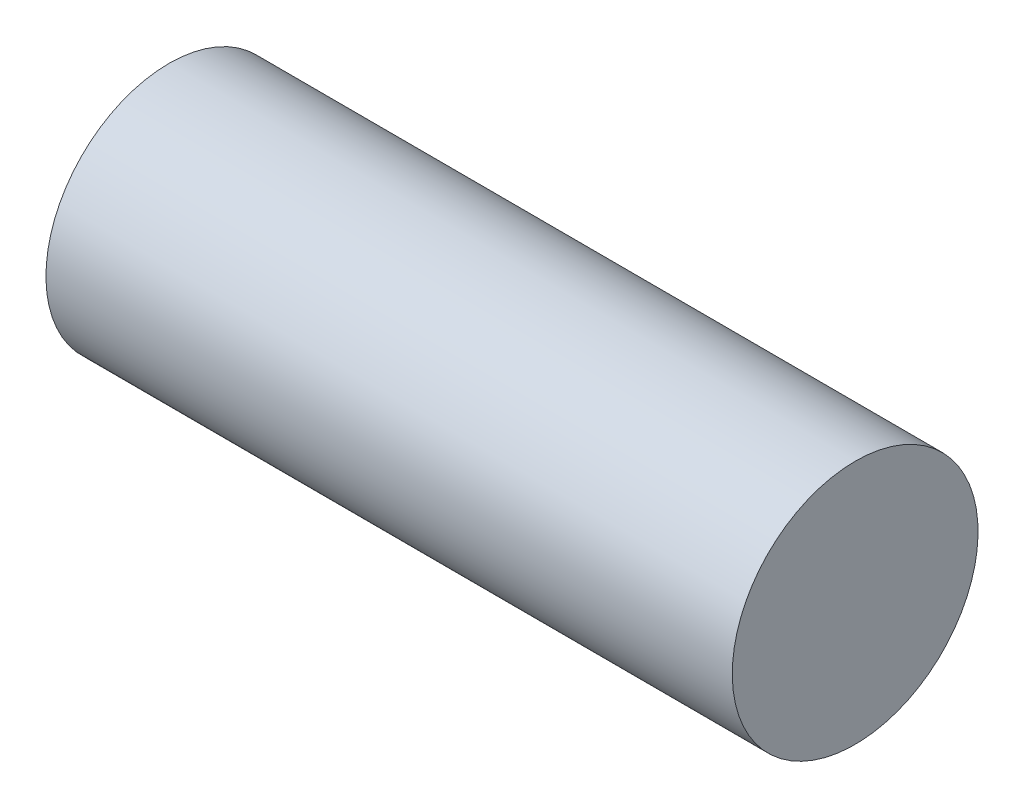
ISO-10303-21;
HEADER;
FILE_DESCRIPTION(('STEP AP214'),'2;1');
FILE_NAME('part.step','',(''),(''),'','','');
FILE_SCHEMA(('AUTOMOTIVE_DESIGN { 1 0 10303 214 1 1 1 1 }'));
ENDSEC;
DATA;
#1=APPLICATION_CONTEXT('core data for automotive mechanical design processes');
#2=APPLICATION_PROTOCOL_DEFINITION('international standard','automotive_design',2000,#1);
#3=PRODUCT_CONTEXT('',#1,'mechanical');
#4=PRODUCT('Part','Part','',(#3));
#5=PRODUCT_RELATED_PRODUCT_CATEGORY('part','',(#4));
#6=PRODUCT_DEFINITION_FORMATION('','',#4);
#7=PRODUCT_DEFINITION_CONTEXT('part definition',#1,'design');
#8=PRODUCT_DEFINITION('design','',#6,#7);
#9=PRODUCT_DEFINITION_SHAPE('','',#8);
#10=(LENGTH_UNIT() NAMED_UNIT(*) SI_UNIT(.MILLI.,.METRE.));
#11=(NAMED_UNIT(*) PLANE_ANGLE_UNIT() SI_UNIT($,.RADIAN.));
#12=(NAMED_UNIT(*) SI_UNIT($,.STERADIAN.) SOLID_ANGLE_UNIT());
#13=UNCERTAINTY_MEASURE_WITH_UNIT(LENGTH_MEASURE(1.E-05),#10,'distance_accuracy_value','');
#14=(GEOMETRIC_REPRESENTATION_CONTEXT(3) GLOBAL_UNCERTAINTY_ASSIGNED_CONTEXT((#13)) GLOBAL_UNIT_ASSIGNED_CONTEXT((#10,
#11,#12)) REPRESENTATION_CONTEXT('',''));
#15=CARTESIAN_POINT('',(0.,0.,0.));
#16=DIRECTION('',(0.,0.,1.));
#17=DIRECTION('',(1.,0.,0.));
#18=AXIS2_PLACEMENT_3D('',#15,#16,#17);
#19=CARTESIAN_POINT('',(-13.5580424451285,200.895063598058,163.321796860767));
#20=DIRECTION('',(0.999998204569047,-0.00189495611617016,-1.97773542619787E-09));
#21=DIRECTION('',(0.00189495611617016,0.999998204569047,0.));
#22=AXIS2_PLACEMENT_3D('',#19,#20,#21);
#23=PLANE('',#22);
#24=CARTESIAN_POINT('',(-13.5580424451285,200.895063598058,163.321796860767));
#25=DIRECTION('',(0.999998204569047,-0.00189495611617016,-1.97773542619787E-09));
#26=DIRECTION('',(0.00189495611617016,0.999998204569047,0.));
#27=AXIS2_PLACEMENT_3D('',#24,#25,#26);
#28=CIRCLE('',#27,4.69900000000001);
#29=CARTESIAN_POINT('',(-13.5491380463386,205.594055161327,163.321796860767));
#30=VERTEX_POINT('',#29);
#31=EDGE_CURVE('E50',#30,#30,#28,.T.);
#32=ORIENTED_EDGE('',*,*,#31,.F.);
#33=EDGE_LOOP('',(#32));
#34=FACE_BOUND('',#33,.T.);
#35=ADVANCED_FACE('F43',(#34),#23,.F.);
#36=CARTESIAN_POINT('',(12.6858057643378,200.845332568093,163.321796808863));
#37=DIRECTION('',(0.999998204569047,-0.00189495611617016,-1.97773542619787E-09));
#38=DIRECTION('',(0.00189495611617016,0.999998204569047,0.));
#39=AXIS2_PLACEMENT_3D('',#36,#37,#38);
#40=PLANE('',#39);
#41=CARTESIAN_POINT('',(12.6858057643378,200.845332568093,163.321796808863));
#42=DIRECTION('',(0.999998204569047,-0.00189495611617016,-1.97773542619787E-09));
#43=DIRECTION('',(0.00189495611617016,0.999998204569047,0.));
#44=AXIS2_PLACEMENT_3D('',#41,#42,#43);
#45=CIRCLE('',#44,4.69900000000001);
#46=CARTESIAN_POINT('',(12.6947101631277,205.544324131363,163.321796808863));
#47=VERTEX_POINT('',#46);
#48=EDGE_CURVE('E11',#47,#47,#45,.T.);
#49=ORIENTED_EDGE('',*,*,#48,.T.);
#50=EDGE_LOOP('',(#49));
#51=FACE_BOUND('',#50,.T.);
#52=ADVANCED_FACE('F60',(#51),#40,.T.);
#53=CARTESIAN_POINT('',(-13.5580424451285,200.895063598058,163.321796860767));
#54=DIRECTION('',(0.999998204569047,-0.0018949561161691,-1.97773542619787E-09));
#55=DIRECTION('',(0.0018949561161691,0.999998204569047,0.));
#56=AXIS2_PLACEMENT_3D('',#53,#54,#55);
#57=CYLINDRICAL_SURFACE('',#56,4.69900000000001);
#58=CARTESIAN_POINT('',(12.6947101631277,205.544324131363,163.321796808863));
#59=CARTESIAN_POINT('',(12.4213367442791,205.544842162925,163.321796809404));
#60=CARTESIAN_POINT('',(12.1479633254305,205.545360194487,163.321796809945));
#61=CARTESIAN_POINT('',(11.6012164877333,205.546396257611,163.321796811026));
#62=CARTESIAN_POINT('',(11.3278430688847,205.546914289173,163.321796811567));
#63=CARTESIAN_POINT('',(10.7810962311875,205.547950352297,163.321796812648));
#64=CARTESIAN_POINT('',(10.5077228123389,205.54846838386,163.321796813189));
#65=CARTESIAN_POINT('',(9.96097597464164,205.549504446984,163.32179681427));
#66=CARTESIAN_POINT('',(9.68760255579303,205.550022478546,163.321796814811));
#67=CARTESIAN_POINT('',(9.14085571809582,205.55105854167,163.321796815892));
#68=CARTESIAN_POINT('',(8.86748229924721,205.551576573232,163.321796816433));
#69=CARTESIAN_POINT('',(8.32073546155,205.552612636357,163.321796817514));
#70=CARTESIAN_POINT('',(8.04736204270139,205.553130667919,163.321796818055));
#71=CARTESIAN_POINT('',(7.50061520500418,205.554166731043,163.321796819136));
#72=CARTESIAN_POINT('',(7.22724178615557,205.554684762605,163.321796819676));
#73=CARTESIAN_POINT('',(6.68049494845836,205.555720825729,163.321796820758));
#74=CARTESIAN_POINT('',(6.40712152960975,205.556238857292,163.321796821298));
#75=CARTESIAN_POINT('',(5.86037469191253,205.557274920416,163.32179682238));
#76=CARTESIAN_POINT('',(5.58700127306393,205.557792951978,163.32179682292));
#77=CARTESIAN_POINT('',(5.04025443536671,205.558829015102,163.321796824002));
#78=CARTESIAN_POINT('',(4.7668810165181,205.559347046664,163.321796824542));
#79=CARTESIAN_POINT('',(4.22013417882089,205.560383109789,163.321796825624));
#80=CARTESIAN_POINT('',(3.94676075997228,205.560901141351,163.321796826164));
#81=CARTESIAN_POINT('',(3.40001392227507,205.561937204475,163.321796827246));
#82=CARTESIAN_POINT('',(3.12664050342646,205.562455236037,163.321796827786));
#83=CARTESIAN_POINT('',(2.57989366572925,205.563491299162,163.321796828868));
#84=CARTESIAN_POINT('',(2.30652024688064,205.564009330724,163.321796829408));
#85=CARTESIAN_POINT('',(1.75977340918343,205.565045393848,163.32179683049));
#86=CARTESIAN_POINT('',(1.48639999033482,205.56556342541,163.32179683103));
#87=CARTESIAN_POINT('',(0.939653152637605,205.566599488534,163.321796832112));
#88=CARTESIAN_POINT('',(0.666279733788998,205.567117520096,163.321796832652));
#89=CARTESIAN_POINT('',(0.119532896091783,205.568153583221,163.321796833734));
#90=CARTESIAN_POINT('',(-0.153840522756825,205.568671614783,163.321796834274));
#91=CARTESIAN_POINT('',(-0.700587360454039,205.569707677907,163.321796835356));
#92=CARTESIAN_POINT('',(-0.973960779302646,205.570225709469,163.321796835896));
#93=CARTESIAN_POINT('',(-1.52070761699986,205.571261772594,163.321796836978));
#94=CARTESIAN_POINT('',(-1.79408103584847,205.571779804156,163.321796837518));
#95=CARTESIAN_POINT('',(-2.34082787354568,205.57281586728,163.3217968386));
#96=CARTESIAN_POINT('',(-2.61420129239429,205.573333898842,163.32179683914));
#97=CARTESIAN_POINT('',(-3.1609481300915,205.574369961966,163.321796840222));
#98=CARTESIAN_POINT('',(-3.43432154894011,205.574887993528,163.321796840762));
#99=CARTESIAN_POINT('',(-3.98106838663733,205.575924056653,163.321796841844));
#100=CARTESIAN_POINT('',(-4.25444180548593,205.576442088215,163.321796842384));
#101=CARTESIAN_POINT('',(-4.80118864318315,205.577478151339,163.321796843466));
#102=CARTESIAN_POINT('',(-5.07456206203175,205.577996182901,163.321796844006));
#103=CARTESIAN_POINT('',(-5.62130889972897,205.579032246026,163.321796845088));
#104=CARTESIAN_POINT('',(-5.89468231857757,205.579550277588,163.321796845628));
#105=CARTESIAN_POINT('',(-6.44142915627479,205.580586340712,163.32179684671));
#106=CARTESIAN_POINT('',(-6.7148025751234,205.581104372274,163.32179684725));
#107=CARTESIAN_POINT('',(-7.26154941282061,205.582140435398,163.321796848332));
#108=CARTESIAN_POINT('',(-7.53492283166922,205.582658466961,163.321796848872));
#109=CARTESIAN_POINT('',(-8.08166966936643,205.583694530085,163.321796849954));
#110=CARTESIAN_POINT('',(-8.35504308821504,205.584212561647,163.321796850494));
#111=CARTESIAN_POINT('',(-8.90178992591225,205.585248624771,163.321796851575));
#112=CARTESIAN_POINT('',(-9.17516334476086,205.585766656333,163.321796852116));
#113=CARTESIAN_POINT('',(-9.72191018245807,205.586802719458,163.321796853197));
#114=CARTESIAN_POINT('',(-9.99528360130668,205.58732075102,163.321796853738));
#115=CARTESIAN_POINT('',(-10.5420304390039,205.588356814144,163.321796854819));
#116=CARTESIAN_POINT('',(-10.8154038578525,205.588874845706,163.32179685536));
#117=CARTESIAN_POINT('',(-11.3621506955497,205.58991090883,163.321796856441));
#118=CARTESIAN_POINT('',(-11.6355241143983,205.590428940393,163.321796856982));
#119=CARTESIAN_POINT('',(-12.1822709520955,205.591465003517,163.321796858063));
#120=CARTESIAN_POINT('',(-12.4556443709441,205.591983035079,163.321796858604));
#121=CARTESIAN_POINT('',(-13.0023912086414,205.593019098203,163.321796859685));
#122=CARTESIAN_POINT('',(-13.27576462749,205.593537129765,163.321796860226));
#123=CARTESIAN_POINT('',(-13.5491380463386,205.594055161327,163.321796860767));
#124=B_SPLINE_CURVE_WITH_KNOTS('',3,(#58,#59,#60,#61,#62,#63,#64,#65,#66,#67,#68,#69,#70,#71,
#72,#73,#74,#75,#76,#77,#78,#79,#80,#81,#82,#83,#84,#85,#86,#87,#88,#89,#90,#91,#92,#93,#94,#95,
#96,#97,#98,#99,#100,#101,#102,#103,#104,#105,#106,#107,#108,#109,#110,#111,#112,#113,#114,#115,
#116,#117,#118,#119,#120,#121,#122,#123),.UNSPECIFIED.,.F.,.F.,(4,2,2,2,2,2,2,2,2,2,2,2,2,2,2,2,
2,2,2,2,2,2,2,2,2,2,2,2,2,2,2,2,4),(0.,0.820121729017757,1.64024345803552,2.46036518705328,
3.28048691607104,4.10060864508879,4.92073037410655,5.74085210312431,6.56097383214207,
7.38109556115983,8.20121729017759,9.02133901919535,9.84146074821311,10.6615824772309,
11.4817042062486,12.3018259352664,13.1219476642841,13.9420693933019,14.7621911223197,
15.5823128513374,16.4024345803552,17.2225563093729,18.0426780383907,18.8627997674085,
19.6829214964262,20.503043225444,21.3231649544617,22.1432866834795,22.9634084124973,
23.783530141515,24.6036518705328,25.4237735995505,26.2438953285683),.UNSPECIFIED.);
#125=EDGE_CURVE('BSEAM57',#47,#30,#124,.T.);
#126=ORIENTED_EDGE('',*,*,#48,.F.);
#127=ORIENTED_EDGE('',*,*,#31,.T.);
#128=ORIENTED_EDGE('',*,*,#125,.T.);
#129=ORIENTED_EDGE('',*,*,#125,.F.);
#130=EDGE_LOOP('',(#126,#128,#127,#129));
#131=FACE_BOUND('',#130,.T.);
#132=ADVANCED_FACE('F57',(#131),#57,.T.);
#133=CLOSED_SHELL('',(#35,#52,#132));
#134=MANIFOLD_SOLID_BREP('B2',#133);
#135=ADVANCED_BREP_SHAPE_REPRESENTATION('',(#18,#134),#14);
#136=SHAPE_DEFINITION_REPRESENTATION(#9,#135);
ENDSEC;
END-ISO-10303-21;
